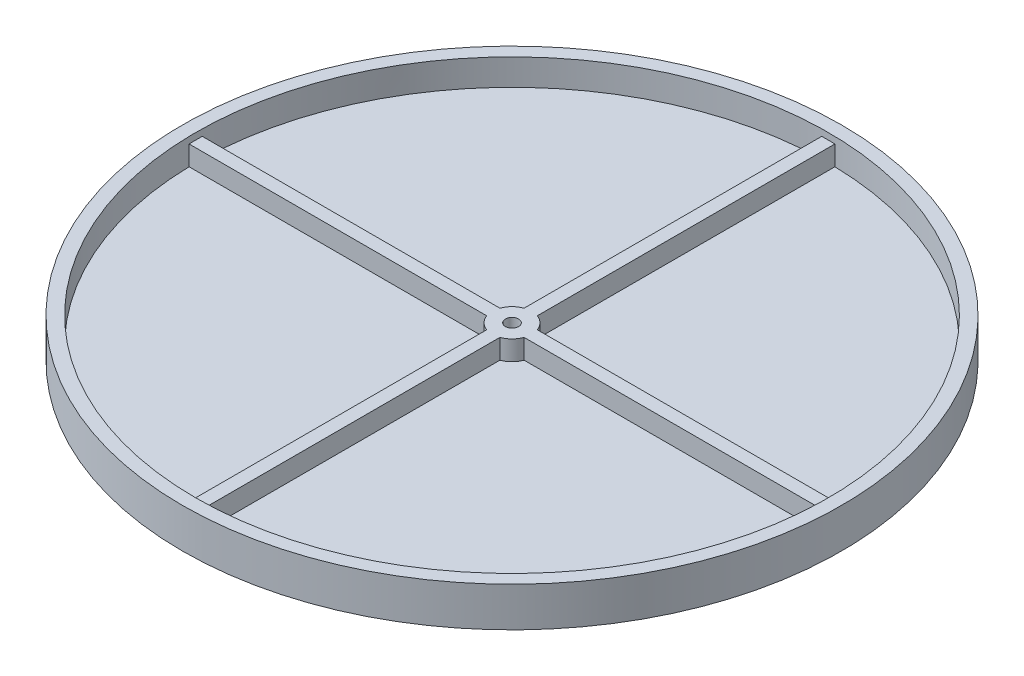
ISO-10303-21;
HEADER;
FILE_DESCRIPTION(('STEP AP214'),'2;1');
FILE_NAME('part.step','',(''),(''),'','','');
FILE_SCHEMA(('AUTOMOTIVE_DESIGN { 1 0 10303 214 1 1 1 1 }'));
ENDSEC;
DATA;
#1=APPLICATION_CONTEXT('core data for automotive mechanical design processes');
#2=APPLICATION_PROTOCOL_DEFINITION('international standard','automotive_design',2000,#1);
#3=PRODUCT_CONTEXT('',#1,'mechanical');
#4=PRODUCT('Part','Part','',(#3));
#5=PRODUCT_RELATED_PRODUCT_CATEGORY('part','',(#4));
#6=PRODUCT_DEFINITION_FORMATION('','',#4);
#7=PRODUCT_DEFINITION_CONTEXT('part definition',#1,'design');
#8=PRODUCT_DEFINITION('design','',#6,#7);
#9=PRODUCT_DEFINITION_SHAPE('','',#8);
#10=(LENGTH_UNIT() NAMED_UNIT(*) SI_UNIT(.MILLI.,.METRE.));
#11=(NAMED_UNIT(*) PLANE_ANGLE_UNIT() SI_UNIT($,.RADIAN.));
#12=(NAMED_UNIT(*) SI_UNIT($,.STERADIAN.) SOLID_ANGLE_UNIT());
#13=UNCERTAINTY_MEASURE_WITH_UNIT(LENGTH_MEASURE(1.E-05),#10,'distance_accuracy_value','');
#14=(GEOMETRIC_REPRESENTATION_CONTEXT(3) GLOBAL_UNCERTAINTY_ASSIGNED_CONTEXT((#13)) GLOBAL_UNIT_ASSIGNED_CONTEXT((#10,
#11,#12)) REPRESENTATION_CONTEXT('',''));
#15=CARTESIAN_POINT('',(0.,0.,0.));
#16=DIRECTION('',(0.,0.,1.));
#17=DIRECTION('',(1.,0.,0.));
#18=AXIS2_PLACEMENT_3D('',#15,#16,#17);
#19=CARTESIAN_POINT('',(0.,30.,0.));
#20=DIRECTION('',(0.,-1.,0.));
#21=DIRECTION('',(0.,0.,-1.));
#22=AXIS2_PLACEMENT_3D('',#19,#20,#21);
#23=CYLINDRICAL_SURFACE('',#22,240.);
#24=CARTESIAN_POINT('',(0.,30.,0.));
#25=DIRECTION('',(0.,1.,0.));
#26=DIRECTION('',(0.,0.,1.));
#27=AXIS2_PLACEMENT_3D('',#24,#25,#26);
#28=CIRCLE('',#27,240.);
#29=CARTESIAN_POINT('',(0.,30.,240.));
#30=VERTEX_POINT('',#29);
#31=EDGE_CURVE('E262',#30,#30,#28,.T.);
#32=ORIENTED_EDGE('',*,*,#31,.T.);
#33=EDGE_LOOP('',(#32));
#34=FACE_BOUND('',#33,.T.);
#35=CARTESIAN_POINT('',(0.,10.,0.));
#36=DIRECTION('',(0.,1.,0.));
#37=DIRECTION('',(0.,0.,1.));
#38=AXIS2_PLACEMENT_3D('',#35,#36,#37);
#39=CIRCLE('',#38,240.);
#40=CARTESIAN_POINT('',(5.00000000000251,10.,-239.947911014036));
#41=VERTEX_POINT('',#40);
#42=CARTESIAN_POINT('',(239.947911014036,10.,-5.));
#43=VERTEX_POINT('',#42);
#44=EDGE_CURVE('E283',#41,#43,#39,.F.);
#45=ORIENTED_EDGE('',*,*,#44,.T.);
#46=DIRECTION('',(0.,-1.,0.));
#47=VECTOR('',#46,1.);
#48=CARTESIAN_POINT('',(239.947911014037,30.,-5.));
#49=LINE('',#48,#47);
#50=CARTESIAN_POINT('',(239.947911014037,25.,-5.));
#51=VERTEX_POINT('',#50);
#52=EDGE_CURVE('E171',#43,#51,#49,.F.);
#53=ORIENTED_EDGE('',*,*,#52,.T.);
#54=CARTESIAN_POINT('',(0.,25.,0.));
#55=DIRECTION('',(0.,1.,0.));
#56=DIRECTION('',(0.,0.,1.));
#57=AXIS2_PLACEMENT_3D('',#54,#55,#56);
#58=CIRCLE('',#57,240.);
#59=CARTESIAN_POINT('',(239.947911014037,25.,5.));
#60=VERTEX_POINT('',#59);
#61=EDGE_CURVE('E247',#60,#51,#58,.T.);
#62=ORIENTED_EDGE('',*,*,#61,.F.);
#63=DIRECTION('',(0.,-1.,0.));
#64=VECTOR('',#63,1.);
#65=CARTESIAN_POINT('',(239.947911014037,30.,5.));
#66=LINE('',#65,#64);
#67=CARTESIAN_POINT('',(239.947911014037,10.,5.));
#68=VERTEX_POINT('',#67);
#69=EDGE_CURVE('E231',#60,#68,#66,.T.);
#70=ORIENTED_EDGE('',*,*,#69,.T.);
#71=CARTESIAN_POINT('',(4.99999999999916,10.,239.947911014037));
#72=VERTEX_POINT('',#71);
#73=EDGE_CURVE('E55',#68,#72,#39,.F.);
#74=ORIENTED_EDGE('',*,*,#73,.T.);
#75=DIRECTION('',(0.,-1.,0.));
#76=VECTOR('',#75,1.);
#77=CARTESIAN_POINT('',(4.99999999999916,30.,239.947911014037));
#78=LINE('',#77,#76);
#79=CARTESIAN_POINT('',(4.99999999999916,25.,239.947911014037));
#80=VERTEX_POINT('',#79);
#81=EDGE_CURVE('E217',#72,#80,#78,.F.);
#82=ORIENTED_EDGE('',*,*,#81,.T.);
#83=CARTESIAN_POINT('',(0.,25.,0.));
#84=DIRECTION('',(0.,1.,0.));
#85=DIRECTION('',(0.,0.,1.));
#86=AXIS2_PLACEMENT_3D('',#83,#84,#85);
#87=CIRCLE('',#86,240.);
#88=CARTESIAN_POINT('',(-5.00000000000084,25.,239.947911014037));
#89=VERTEX_POINT('',#88);
#90=EDGE_CURVE('E244',#89,#80,#87,.T.);
#91=ORIENTED_EDGE('',*,*,#90,.F.);
#92=DIRECTION('',(0.,-1.,0.));
#93=VECTOR('',#92,1.);
#94=CARTESIAN_POINT('',(-5.00000000000084,30.,239.947911014037));
#95=LINE('',#94,#93);
#96=CARTESIAN_POINT('',(-5.00000000000084,10.,239.947911014037));
#97=VERTEX_POINT('',#96);
#98=EDGE_CURVE('E224',#89,#97,#95,.T.);
#99=ORIENTED_EDGE('',*,*,#98,.T.);
#100=CARTESIAN_POINT('',(-239.947911014037,10.,4.99999999999832));
#101=VERTEX_POINT('',#100);
#102=EDGE_CURVE('E11',#97,#101,#39,.F.);
#103=ORIENTED_EDGE('',*,*,#102,.T.);
#104=DIRECTION('',(0.,-1.,0.));
#105=VECTOR('',#104,1.);
#106=CARTESIAN_POINT('',(-239.947911014037,30.,4.99999999999832));
#107=LINE('',#106,#105);
#108=CARTESIAN_POINT('',(-239.947911014037,25.,4.99999999999832));
#109=VERTEX_POINT('',#108);
#110=EDGE_CURVE('E203',#101,#109,#107,.F.);
#111=ORIENTED_EDGE('',*,*,#110,.T.);
#112=CARTESIAN_POINT('',(0.,25.,0.));
#113=DIRECTION('',(0.,1.,0.));
#114=DIRECTION('',(0.,0.,1.));
#115=AXIS2_PLACEMENT_3D('',#112,#113,#114);
#116=CIRCLE('',#115,240.);
#117=CARTESIAN_POINT('',(-239.947911014037,25.,-5.00000000000168));
#118=VERTEX_POINT('',#117);
#119=EDGE_CURVE('E170',#118,#109,#116,.T.);
#120=ORIENTED_EDGE('',*,*,#119,.F.);
#121=DIRECTION('',(0.,-1.,0.));
#122=VECTOR('',#121,1.);
#123=CARTESIAN_POINT('',(-239.947911014037,30.,-5.00000000000168));
#124=LINE('',#123,#122);
#125=CARTESIAN_POINT('',(-239.947911014037,10.,-5.00000000000168));
#126=VERTEX_POINT('',#125);
#127=EDGE_CURVE('E210',#118,#126,#124,.T.);
#128=ORIENTED_EDGE('',*,*,#127,.T.);
#129=CARTESIAN_POINT('',(-4.99999999999749,10.,-239.947911014037));
#130=VERTEX_POINT('',#129);
#131=EDGE_CURVE('E54',#126,#130,#39,.F.);
#132=ORIENTED_EDGE('',*,*,#131,.T.);
#133=DIRECTION('',(0.,-1.,0.));
#134=VECTOR('',#133,1.);
#135=CARTESIAN_POINT('',(-4.99999999999749,30.,-239.947911014037));
#136=LINE('',#135,#134);
#137=CARTESIAN_POINT('',(-4.99999999999749,25.,-239.947911014037));
#138=VERTEX_POINT('',#137);
#139=EDGE_CURVE('E175',#130,#138,#136,.F.);
#140=ORIENTED_EDGE('',*,*,#139,.T.);
#141=CARTESIAN_POINT('',(0.,25.,0.));
#142=DIRECTION('',(0.,1.,0.));
#143=DIRECTION('',(0.,0.,1.));
#144=AXIS2_PLACEMENT_3D('',#141,#142,#143);
#145=CIRCLE('',#144,240.);
#146=CARTESIAN_POINT('',(5.00000000000251,25.,-239.947911014036));
#147=VERTEX_POINT('',#146);
#148=EDGE_CURVE('E160',#147,#138,#145,.T.);
#149=ORIENTED_EDGE('',*,*,#148,.F.);
#150=DIRECTION('',(0.,-1.,0.));
#151=VECTOR('',#150,1.);
#152=CARTESIAN_POINT('',(5.00000000000251,30.,-239.947911014036));
#153=LINE('',#152,#151);
#154=EDGE_CURVE('E192',#147,#41,#153,.T.);
#155=ORIENTED_EDGE('',*,*,#154,.T.);
#156=EDGE_LOOP('',(#45,#53,#62,#70,#74,#82,#91,#99,#103,#111,#120,#128,#132,#140,#149,#155));
#157=FACE_BOUND('',#156,.T.);
#158=ADVANCED_FACE('F45',(#34,#157),#23,.F.);
#159=CARTESIAN_POINT('',(0.,10.,0.));
#160=DIRECTION('',(0.,1.,0.));
#161=DIRECTION('',(0.,0.,1.));
#162=AXIS2_PLACEMENT_3D('',#159,#160,#161);
#163=PLANE('',#162);
#164=CARTESIAN_POINT('',(0.,10.,0.));
#165=DIRECTION('',(0.,1.,0.));
#166=DIRECTION('',(0.,0.,1.));
#167=AXIS2_PLACEMENT_3D('',#164,#165,#166);
#168=CIRCLE('',#167,15.);
#169=CARTESIAN_POINT('',(14.1421356237309,10.,-5.));
#170=VERTEX_POINT('',#169);
#171=CARTESIAN_POINT('',(5.00000000000015,10.,-14.1421356237309));
#172=VERTEX_POINT('',#171);
#173=EDGE_CURVE('E269',#170,#172,#168,.T.);
#174=ORIENTED_EDGE('',*,*,#173,.F.);
#175=DIRECTION('',(-1.,0.,0.));
#176=VECTOR('',#175,1.);
#177=CARTESIAN_POINT('',(9.14064565716402,10.,-5.));
#178=LINE('',#177,#176);
#179=EDGE_CURVE('E296',#43,#170,#178,.T.);
#180=ORIENTED_EDGE('',*,*,#179,.F.);
#181=ORIENTED_EDGE('',*,*,#44,.F.);
#182=DIRECTION('',(0.,0.,-1.));
#183=VECTOR('',#182,1.);
#184=CARTESIAN_POINT('',(5.00000000000256,10.,-244.184669500283));
#185=LINE('',#184,#183);
#186=EDGE_CURVE('E294',#172,#41,#185,.T.);
#187=ORIENTED_EDGE('',*,*,#186,.F.);
#188=EDGE_LOOP('',(#174,#180,#181,#187));
#189=FACE_BOUND('',#188,.T.);
#190=ADVANCED_FACE('F293',(#189),#163,.T.);
#191=ORIENTED_EDGE('',*,*,#73,.F.);
#192=DIRECTION('',(1.,0.,0.));
#193=VECTOR('',#192,1.);
#194=CARTESIAN_POINT('',(244.184669500283,10.,5.));
#195=LINE('',#194,#193);
#196=CARTESIAN_POINT('',(14.1421356237309,10.,5.));
#197=VERTEX_POINT('',#196);
#198=EDGE_CURVE('E300',#197,#68,#195,.T.);
#199=ORIENTED_EDGE('',*,*,#198,.F.);
#200=CARTESIAN_POINT('',(4.99999999999995,10.,14.142135623731));
#201=VERTEX_POINT('',#200);
#202=EDGE_CURVE('E265',#201,#197,#168,.T.);
#203=ORIENTED_EDGE('',*,*,#202,.F.);
#204=DIRECTION('',(0.,0.,-1.));
#205=VECTOR('',#204,1.);
#206=CARTESIAN_POINT('',(4.99999999999997,10.,9.14064565716404));
#207=LINE('',#206,#205);
#208=EDGE_CURVE('E307',#72,#201,#207,.T.);
#209=ORIENTED_EDGE('',*,*,#208,.F.);
#210=EDGE_LOOP('',(#191,#199,#203,#209));
#211=FACE_BOUND('',#210,.T.);
#212=ADVANCED_FACE('F382',(#211),#163,.T.);
#213=ORIENTED_EDGE('',*,*,#102,.F.);
#214=DIRECTION('',(0.,0.,1.));
#215=VECTOR('',#214,1.);
#216=CARTESIAN_POINT('',(-5.00000000000085,10.,244.184669500283));
#217=LINE('',#216,#215);
#218=CARTESIAN_POINT('',(-5.00000000000005,10.,14.1421356237309));
#219=VERTEX_POINT('',#218);
#220=EDGE_CURVE('E301',#219,#97,#217,.T.);
#221=ORIENTED_EDGE('',*,*,#220,.F.);
#222=CARTESIAN_POINT('',(-14.142135623731,10.,4.9999999999999));
#223=VERTEX_POINT('',#222);
#224=EDGE_CURVE('E255',#223,#219,#168,.T.);
#225=ORIENTED_EDGE('',*,*,#224,.F.);
#226=DIRECTION('',(1.,0.,0.));
#227=VECTOR('',#226,1.);
#228=CARTESIAN_POINT('',(-9.14064565716406,10.,4.99999999999994));
#229=LINE('',#228,#227);
#230=EDGE_CURVE('E327',#101,#223,#229,.T.);
#231=ORIENTED_EDGE('',*,*,#230,.F.);
#232=EDGE_LOOP('',(#213,#221,#225,#231));
#233=FACE_BOUND('',#232,.T.);
#234=ADVANCED_FACE('F364',(#233),#163,.T.);
#235=ORIENTED_EDGE('',*,*,#131,.F.);
#236=DIRECTION('',(-1.,0.,0.));
#237=VECTOR('',#236,1.);
#238=CARTESIAN_POINT('',(-244.184669500283,10.,-5.00000000000171));
#239=LINE('',#238,#237);
#240=CARTESIAN_POINT('',(-14.1421356237309,10.,-5.0000000000001));
#241=VERTEX_POINT('',#240);
#242=EDGE_CURVE('E321',#241,#126,#239,.T.);
#243=ORIENTED_EDGE('',*,*,#242,.F.);
#244=CARTESIAN_POINT('',(-4.99999999999985,10.,-14.142135623731));
#245=VERTEX_POINT('',#244);
#246=EDGE_CURVE('E346',#245,#241,#168,.T.);
#247=ORIENTED_EDGE('',*,*,#246,.F.);
#248=DIRECTION('',(0.,0.,1.));
#249=VECTOR('',#248,1.);
#250=CARTESIAN_POINT('',(-4.99999999999991,10.,-9.14064565716407));
#251=LINE('',#250,#249);
#252=EDGE_CURVE('E181',#130,#245,#251,.T.);
#253=ORIENTED_EDGE('',*,*,#252,.F.);
#254=EDGE_LOOP('',(#235,#243,#247,#253));
#255=FACE_BOUND('',#254,.T.);
#256=ADVANCED_FACE('F349',(#255),#163,.T.);
#257=CARTESIAN_POINT('',(0.,25.,0.));
#258=DIRECTION('',(0.,-1.,0.));
#259=DIRECTION('',(0.,0.,-1.));
#260=AXIS2_PLACEMENT_3D('',#257,#258,#259);
#261=CYLINDRICAL_SURFACE('',#260,15.);
#262=DIRECTION('',(0.,-1.,0.));
#263=VECTOR('',#262,1.);
#264=CARTESIAN_POINT('',(14.142135623731,25.,-5.));
#265=LINE('',#264,#263);
#266=CARTESIAN_POINT('',(14.142135623731,25.,-5.));
#267=VERTEX_POINT('',#266);
#268=EDGE_CURVE('E235',#170,#267,#265,.F.);
#269=ORIENTED_EDGE('',*,*,#268,.F.);
#270=ORIENTED_EDGE('',*,*,#173,.T.);
#271=DIRECTION('',(0.,-1.,0.));
#272=VECTOR('',#271,1.);
#273=CARTESIAN_POINT('',(5.00000000000015,25.,-14.1421356237309));
#274=LINE('',#273,#272);
#275=CARTESIAN_POINT('',(5.00000000000015,25.,-14.1421356237309));
#276=VERTEX_POINT('',#275);
#277=EDGE_CURVE('E188',#276,#172,#274,.T.);
#278=ORIENTED_EDGE('',*,*,#277,.F.);
#279=CARTESIAN_POINT('',(0.,25.,0.));
#280=DIRECTION('',(0.,1.,0.));
#281=DIRECTION('',(0.,0.,1.));
#282=AXIS2_PLACEMENT_3D('',#279,#280,#281);
#283=CIRCLE('',#282,15.);
#284=EDGE_CURVE('E263',#267,#276,#283,.T.);
#285=ORIENTED_EDGE('',*,*,#284,.F.);
#286=EDGE_LOOP('',(#269,#270,#278,#285));
#287=FACE_BOUND('',#286,.T.);
#288=ADVANCED_FACE('F401',(#287),#261,.T.);
#289=DIRECTION('',(0.,-1.,0.));
#290=VECTOR('',#289,1.);
#291=CARTESIAN_POINT('',(14.142135623731,25.,5.));
#292=LINE('',#291,#290);
#293=CARTESIAN_POINT('',(14.142135623731,25.,5.));
#294=VERTEX_POINT('',#293);
#295=EDGE_CURVE('E228',#294,#197,#292,.T.);
#296=ORIENTED_EDGE('',*,*,#295,.F.);
#297=CARTESIAN_POINT('',(4.99999999999995,25.,14.142135623731));
#298=VERTEX_POINT('',#297);
#299=EDGE_CURVE('E259',#298,#294,#283,.T.);
#300=ORIENTED_EDGE('',*,*,#299,.F.);
#301=DIRECTION('',(0.,-1.,0.));
#302=VECTOR('',#301,1.);
#303=CARTESIAN_POINT('',(4.99999999999995,25.,14.142135623731));
#304=LINE('',#303,#302);
#305=EDGE_CURVE('E213',#201,#298,#304,.F.);
#306=ORIENTED_EDGE('',*,*,#305,.F.);
#307=ORIENTED_EDGE('',*,*,#202,.T.);
#308=EDGE_LOOP('',(#296,#300,#306,#307));
#309=FACE_BOUND('',#308,.T.);
#310=ADVANCED_FACE('F377',(#309),#261,.T.);
#311=DIRECTION('',(0.,-1.,0.));
#312=VECTOR('',#311,1.);
#313=CARTESIAN_POINT('',(-5.00000000000005,25.,14.1421356237309));
#314=LINE('',#313,#312);
#315=CARTESIAN_POINT('',(-5.00000000000005,25.,14.1421356237309));
#316=VERTEX_POINT('',#315);
#317=EDGE_CURVE('E221',#316,#219,#314,.T.);
#318=ORIENTED_EDGE('',*,*,#317,.F.);
#319=CARTESIAN_POINT('',(-14.142135623731,25.,4.9999999999999));
#320=VERTEX_POINT('',#319);
#321=EDGE_CURVE('E264',#320,#316,#283,.T.);
#322=ORIENTED_EDGE('',*,*,#321,.F.);
#323=DIRECTION('',(0.,-1.,0.));
#324=VECTOR('',#323,1.);
#325=CARTESIAN_POINT('',(-14.142135623731,25.,4.9999999999999));
#326=LINE('',#325,#324);
#327=EDGE_CURVE('E200',#223,#320,#326,.F.);
#328=ORIENTED_EDGE('',*,*,#327,.F.);
#329=ORIENTED_EDGE('',*,*,#224,.T.);
#330=EDGE_LOOP('',(#318,#322,#328,#329));
#331=FACE_BOUND('',#330,.T.);
#332=ADVANCED_FACE('F358',(#331),#261,.T.);
#333=DIRECTION('',(0.,-1.,0.));
#334=VECTOR('',#333,1.);
#335=CARTESIAN_POINT('',(-14.1421356237309,25.,-5.0000000000001));
#336=LINE('',#335,#334);
#337=CARTESIAN_POINT('',(-14.1421356237309,25.,-5.0000000000001));
#338=VERTEX_POINT('',#337);
#339=EDGE_CURVE('E207',#338,#241,#336,.T.);
#340=ORIENTED_EDGE('',*,*,#339,.F.);
#341=CARTESIAN_POINT('',(-4.99999999999985,25.,-14.142135623731));
#342=VERTEX_POINT('',#341);
#343=EDGE_CURVE('E347',#342,#338,#283,.T.);
#344=ORIENTED_EDGE('',*,*,#343,.F.);
#345=DIRECTION('',(0.,-1.,0.));
#346=VECTOR('',#345,1.);
#347=CARTESIAN_POINT('',(-4.99999999999985,25.,-14.142135623731));
#348=LINE('',#347,#346);
#349=EDGE_CURVE('E178',#245,#342,#348,.F.);
#350=ORIENTED_EDGE('',*,*,#349,.F.);
#351=ORIENTED_EDGE('',*,*,#246,.T.);
#352=EDGE_LOOP('',(#340,#344,#350,#351));
#353=FACE_BOUND('',#352,.T.);
#354=ADVANCED_FACE('F345',(#353),#261,.T.);
#355=CARTESIAN_POINT('',(0.,10.,0.));
#356=DIRECTION('',(0.,-1.,0.));
#357=DIRECTION('',(0.,0.,-1.));
#358=AXIS2_PLACEMENT_3D('',#355,#356,#357);
#359=CYLINDRICAL_SURFACE('',#358,250.);
#360=CARTESIAN_POINT('',(0.,0.,0.));
#361=DIRECTION('',(0.,1.,0.));
#362=DIRECTION('',(0.,0.,1.));
#363=AXIS2_PLACEMENT_3D('',#360,#361,#362);
#364=CIRCLE('',#363,250.);
#365=CARTESIAN_POINT('',(0.,0.,250.));
#366=VERTEX_POINT('',#365);
#367=EDGE_CURVE('E276',#366,#366,#364,.T.);
#368=ORIENTED_EDGE('',*,*,#367,.T.);
#369=EDGE_LOOP('',(#368));
#370=FACE_BOUND('',#369,.T.);
#371=CARTESIAN_POINT('',(0.,30.,0.));
#372=DIRECTION('',(0.,1.,0.));
#373=DIRECTION('',(0.,0.,1.));
#374=AXIS2_PLACEMENT_3D('',#371,#372,#373);
#375=CIRCLE('',#374,250.);
#376=CARTESIAN_POINT('',(0.,30.,250.));
#377=VERTEX_POINT('',#376);
#378=EDGE_CURVE('E273',#377,#377,#375,.T.);
#379=ORIENTED_EDGE('',*,*,#378,.F.);
#380=EDGE_LOOP('',(#379));
#381=FACE_BOUND('',#380,.T.);
#382=ADVANCED_FACE('F47',(#370,#381),#359,.T.);
#383=CARTESIAN_POINT('',(0.,0.,0.));
#384=DIRECTION('',(0.,1.,0.));
#385=DIRECTION('',(0.,0.,1.));
#386=AXIS2_PLACEMENT_3D('',#383,#384,#385);
#387=PLANE('',#386);
#388=CARTESIAN_POINT('',(0.,0.,0.));
#389=DIRECTION('',(0.,1.,0.));
#390=DIRECTION('',(0.,0.,1.));
#391=AXIS2_PLACEMENT_3D('',#388,#389,#390);
#392=CIRCLE('',#391,5.);
#393=CARTESIAN_POINT('',(0.,0.,5.));
#394=VERTEX_POINT('',#393);
#395=EDGE_CURVE('E251',#394,#394,#392,.T.);
#396=ORIENTED_EDGE('',*,*,#395,.T.);
#397=EDGE_LOOP('',(#396));
#398=FACE_BOUND('',#397,.T.);
#399=ORIENTED_EDGE('',*,*,#367,.F.);
#400=EDGE_LOOP('',(#399));
#401=FACE_BOUND('',#400,.T.);
#402=ADVANCED_FACE('F405',(#398,#401),#387,.F.);
#403=CARTESIAN_POINT('',(0.,30.,0.));
#404=DIRECTION('',(0.,1.,0.));
#405=DIRECTION('',(0.,0.,1.));
#406=AXIS2_PLACEMENT_3D('',#403,#404,#405);
#407=PLANE('',#406);
#408=ORIENTED_EDGE('',*,*,#378,.T.);
#409=EDGE_LOOP('',(#408));
#410=FACE_BOUND('',#409,.T.);
#411=ORIENTED_EDGE('',*,*,#31,.F.);
#412=EDGE_LOOP('',(#411));
#413=FACE_BOUND('',#412,.T.);
#414=ADVANCED_FACE('F403',(#410,#413),#407,.T.);
#415=CARTESIAN_POINT('',(0.,25.,0.));
#416=DIRECTION('',(0.,1.,0.));
#417=DIRECTION('',(0.,0.,1.));
#418=AXIS2_PLACEMENT_3D('',#415,#416,#417);
#419=PLANE('',#418);
#420=ORIENTED_EDGE('',*,*,#299,.T.);
#421=DIRECTION('',(1.,0.,0.));
#422=VECTOR('',#421,1.);
#423=CARTESIAN_POINT('',(244.184669500283,25.,5.));
#424=LINE('',#423,#422);
#425=EDGE_CURVE('E194',#294,#60,#424,.T.);
#426=ORIENTED_EDGE('',*,*,#425,.T.);
#427=ORIENTED_EDGE('',*,*,#61,.T.);
#428=DIRECTION('',(-1.,0.,0.));
#429=VECTOR('',#428,1.);
#430=CARTESIAN_POINT('',(9.14064565716402,25.,-5.));
#431=LINE('',#430,#429);
#432=EDGE_CURVE('E305',#51,#267,#431,.T.);
#433=ORIENTED_EDGE('',*,*,#432,.T.);
#434=ORIENTED_EDGE('',*,*,#284,.T.);
#435=DIRECTION('',(0.,0.,-1.));
#436=VECTOR('',#435,1.);
#437=CARTESIAN_POINT('',(5.00000000000256,25.,-244.184669500283));
#438=LINE('',#437,#436);
#439=EDGE_CURVE('E165',#276,#147,#438,.T.);
#440=ORIENTED_EDGE('',*,*,#439,.T.);
#441=ORIENTED_EDGE('',*,*,#148,.T.);
#442=DIRECTION('',(0.,0.,1.));
#443=VECTOR('',#442,1.);
#444=CARTESIAN_POINT('',(-4.99999999999991,25.,-9.14064565716407));
#445=LINE('',#444,#443);
#446=EDGE_CURVE('E69',#138,#342,#445,.T.);
#447=ORIENTED_EDGE('',*,*,#446,.T.);
#448=ORIENTED_EDGE('',*,*,#343,.T.);
#449=DIRECTION('',(-1.,0.,0.));
#450=VECTOR('',#449,1.);
#451=CARTESIAN_POINT('',(-244.184669500283,25.,-5.00000000000171));
#452=LINE('',#451,#450);
#453=EDGE_CURVE('E328',#338,#118,#452,.T.);
#454=ORIENTED_EDGE('',*,*,#453,.T.);
#455=ORIENTED_EDGE('',*,*,#119,.T.);
#456=DIRECTION('',(1.,0.,0.));
#457=VECTOR('',#456,1.);
#458=CARTESIAN_POINT('',(-9.14064565716406,25.,4.99999999999994));
#459=LINE('',#458,#457);
#460=EDGE_CURVE('E62',#109,#320,#459,.T.);
#461=ORIENTED_EDGE('',*,*,#460,.T.);
#462=ORIENTED_EDGE('',*,*,#321,.T.);
#463=DIRECTION('',(0.,0.,1.));
#464=VECTOR('',#463,1.);
#465=CARTESIAN_POINT('',(-5.00000000000085,25.,244.184669500283));
#466=LINE('',#465,#464);
#467=EDGE_CURVE('E318',#316,#89,#466,.T.);
#468=ORIENTED_EDGE('',*,*,#467,.T.);
#469=ORIENTED_EDGE('',*,*,#90,.T.);
#470=DIRECTION('',(0.,0.,-1.));
#471=VECTOR('',#470,1.);
#472=CARTESIAN_POINT('',(4.99999999999997,25.,9.14064565716404));
#473=LINE('',#472,#471);
#474=EDGE_CURVE('E315',#80,#298,#473,.T.);
#475=ORIENTED_EDGE('',*,*,#474,.T.);
#476=EDGE_LOOP('',(#420,#426,#427,#433,#434,#440,#441,#447,#448,#454,#455,#461,#462,#468,#469,#475));
#477=FACE_BOUND('',#476,.T.);
#478=CARTESIAN_POINT('',(0.,25.,0.));
#479=DIRECTION('',(0.,1.,0.));
#480=DIRECTION('',(0.,0.,1.));
#481=AXIS2_PLACEMENT_3D('',#478,#479,#480);
#482=CIRCLE('',#481,5.);
#483=CARTESIAN_POINT('',(0.,25.,5.));
#484=VERTEX_POINT('',#483);
#485=EDGE_CURVE('E250',#484,#484,#482,.T.);
#486=ORIENTED_EDGE('',*,*,#485,.F.);
#487=EDGE_LOOP('',(#486));
#488=FACE_BOUND('',#487,.T.);
#489=ADVANCED_FACE('F162',(#477,#488),#419,.T.);
#490=CARTESIAN_POINT('',(0.,0.,0.));
#491=DIRECTION('',(0.,1.,0.));
#492=DIRECTION('',(0.,0.,1.));
#493=AXIS2_PLACEMENT_3D('',#490,#491,#492);
#494=CYLINDRICAL_SURFACE('',#493,5.);
#495=ORIENTED_EDGE('',*,*,#395,.F.);
#496=EDGE_LOOP('',(#495));
#497=FACE_BOUND('',#496,.T.);
#498=ORIENTED_EDGE('',*,*,#485,.T.);
#499=EDGE_LOOP('',(#498));
#500=FACE_BOUND('',#499,.T.);
#501=ADVANCED_FACE('F415',(#497,#500),#494,.F.);
#502=CARTESIAN_POINT('',(5.00000000000256,260.256653772779,-244.184669500283));
#503=DIRECTION('',(-1.,0.,0.));
#504=DIRECTION('',(0.,0.,1.));
#505=AXIS2_PLACEMENT_3D('',#502,#503,#504);
#506=PLANE('',#505);
#507=ORIENTED_EDGE('',*,*,#154,.F.);
#508=ORIENTED_EDGE('',*,*,#439,.F.);
#509=ORIENTED_EDGE('',*,*,#277,.T.);
#510=ORIENTED_EDGE('',*,*,#186,.T.);
#511=EDGE_LOOP('',(#507,#508,#509,#510));
#512=FACE_BOUND('',#511,.T.);
#513=ADVANCED_FACE('F417',(#512),#506,.F.);
#514=CARTESIAN_POINT('',(-4.99999999999991,260.256653772779,-9.14064565716407));
#515=DIRECTION('',(1.,0.,0.));
#516=DIRECTION('',(0.,0.,-1.));
#517=AXIS2_PLACEMENT_3D('',#514,#515,#516);
#518=PLANE('',#517);
#519=ORIENTED_EDGE('',*,*,#139,.F.);
#520=ORIENTED_EDGE('',*,*,#252,.T.);
#521=ORIENTED_EDGE('',*,*,#349,.T.);
#522=ORIENTED_EDGE('',*,*,#446,.F.);
#523=EDGE_LOOP('',(#519,#520,#521,#522));
#524=FACE_BOUND('',#523,.T.);
#525=ADVANCED_FACE('F174',(#524),#518,.F.);
#526=CARTESIAN_POINT('',(-244.184669500283,260.256653772779,-5.00000000000171));
#527=DIRECTION('',(0.,0.,1.));
#528=DIRECTION('',(1.,0.,0.));
#529=AXIS2_PLACEMENT_3D('',#526,#527,#528);
#530=PLANE('',#529);
#531=ORIENTED_EDGE('',*,*,#127,.F.);
#532=ORIENTED_EDGE('',*,*,#453,.F.);
#533=ORIENTED_EDGE('',*,*,#339,.T.);
#534=ORIENTED_EDGE('',*,*,#242,.T.);
#535=EDGE_LOOP('',(#531,#532,#533,#534));
#536=FACE_BOUND('',#535,.T.);
#537=ADVANCED_FACE('F428',(#536),#530,.F.);
#538=CARTESIAN_POINT('',(-9.14064565716406,260.256653772779,4.99999999999994));
#539=DIRECTION('',(0.,0.,-1.));
#540=DIRECTION('',(-1.,0.,0.));
#541=AXIS2_PLACEMENT_3D('',#538,#539,#540);
#542=PLANE('',#541);
#543=ORIENTED_EDGE('',*,*,#110,.F.);
#544=ORIENTED_EDGE('',*,*,#230,.T.);
#545=ORIENTED_EDGE('',*,*,#327,.T.);
#546=ORIENTED_EDGE('',*,*,#460,.F.);
#547=EDGE_LOOP('',(#543,#544,#545,#546));
#548=FACE_BOUND('',#547,.T.);
#549=ADVANCED_FACE('F431',(#548),#542,.F.);
#550=CARTESIAN_POINT('',(-5.00000000000085,260.256653772779,244.184669500283));
#551=DIRECTION('',(1.,0.,0.));
#552=DIRECTION('',(0.,0.,-1.));
#553=AXIS2_PLACEMENT_3D('',#550,#551,#552);
#554=PLANE('',#553);
#555=ORIENTED_EDGE('',*,*,#98,.F.);
#556=ORIENTED_EDGE('',*,*,#467,.F.);
#557=ORIENTED_EDGE('',*,*,#317,.T.);
#558=ORIENTED_EDGE('',*,*,#220,.T.);
#559=EDGE_LOOP('',(#555,#556,#557,#558));
#560=FACE_BOUND('',#559,.T.);
#561=ADVANCED_FACE('F366',(#560),#554,.F.);
#562=CARTESIAN_POINT('',(4.99999999999997,260.256653772779,9.14064565716404));
#563=DIRECTION('',(-1.,0.,0.));
#564=DIRECTION('',(0.,0.,1.));
#565=AXIS2_PLACEMENT_3D('',#562,#563,#564);
#566=PLANE('',#565);
#567=ORIENTED_EDGE('',*,*,#81,.F.);
#568=ORIENTED_EDGE('',*,*,#208,.T.);
#569=ORIENTED_EDGE('',*,*,#305,.T.);
#570=ORIENTED_EDGE('',*,*,#474,.F.);
#571=EDGE_LOOP('',(#567,#568,#569,#570));
#572=FACE_BOUND('',#571,.T.);
#573=ADVANCED_FACE('F370',(#572),#566,.F.);
#574=CARTESIAN_POINT('',(9.14064565716402,260.256653772779,-5.));
#575=DIRECTION('',(0.,0.,1.));
#576=DIRECTION('',(1.,0.,0.));
#577=AXIS2_PLACEMENT_3D('',#574,#575,#576);
#578=PLANE('',#577);
#579=ORIENTED_EDGE('',*,*,#52,.F.);
#580=ORIENTED_EDGE('',*,*,#179,.T.);
#581=ORIENTED_EDGE('',*,*,#268,.T.);
#582=ORIENTED_EDGE('',*,*,#432,.F.);
#583=EDGE_LOOP('',(#579,#580,#581,#582));
#584=FACE_BOUND('',#583,.T.);
#585=ADVANCED_FACE('F385',(#584),#578,.F.);
#586=CARTESIAN_POINT('',(244.184669500283,260.256653772779,5.));
#587=DIRECTION('',(0.,0.,-1.));
#588=DIRECTION('',(-1.,0.,0.));
#589=AXIS2_PLACEMENT_3D('',#586,#587,#588);
#590=PLANE('',#589);
#591=ORIENTED_EDGE('',*,*,#69,.F.);
#592=ORIENTED_EDGE('',*,*,#425,.F.);
#593=ORIENTED_EDGE('',*,*,#295,.T.);
#594=ORIENTED_EDGE('',*,*,#198,.T.);
#595=EDGE_LOOP('',(#591,#592,#593,#594));
#596=FACE_BOUND('',#595,.T.);
#597=ADVANCED_FACE('F383',(#596),#590,.F.);
#598=CLOSED_SHELL('',(#158,#190,#212,#234,#256,#288,#310,#332,#354,#382,#402,#414,#489,#501,
#513,#525,#537,#549,#561,#573,#585,#597));
#599=MANIFOLD_SOLID_BREP('B2',#598);
#600=ADVANCED_BREP_SHAPE_REPRESENTATION('',(#18,#599),#14);
#601=SHAPE_DEFINITION_REPRESENTATION(#9,#600);
ENDSEC;
END-ISO-10303-21;
